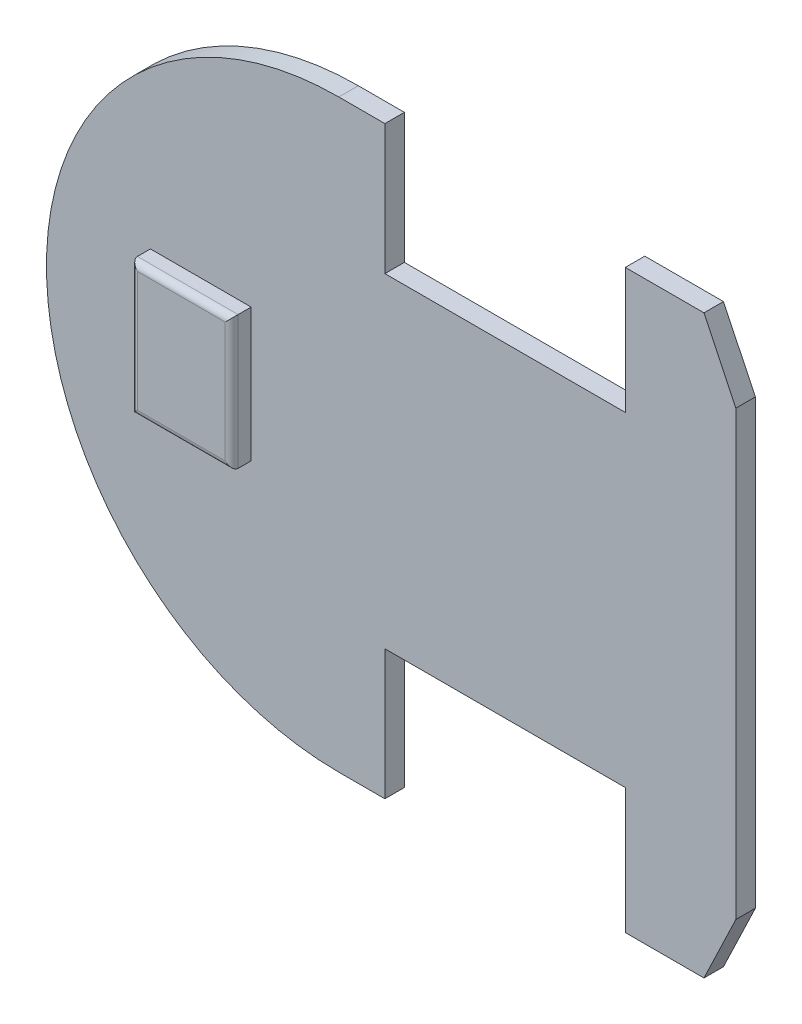
ISO-10303-21;
HEADER;
FILE_DESCRIPTION(('STEP AP214'),'2;1');
FILE_NAME('part.step','',(''),(''),'','','');
FILE_SCHEMA(('AUTOMOTIVE_DESIGN { 1 0 10303 214 1 1 1 1 }'));
ENDSEC;
DATA;
#1=APPLICATION_CONTEXT('core data for automotive mechanical design processes');
#2=APPLICATION_PROTOCOL_DEFINITION('international standard','automotive_design',2000,#1);
#3=PRODUCT_CONTEXT('',#1,'mechanical');
#4=PRODUCT('Part','Part','',(#3));
#5=PRODUCT_RELATED_PRODUCT_CATEGORY('part','',(#4));
#6=PRODUCT_DEFINITION_FORMATION('','',#4);
#7=PRODUCT_DEFINITION_CONTEXT('part definition',#1,'design');
#8=PRODUCT_DEFINITION('design','',#6,#7);
#9=PRODUCT_DEFINITION_SHAPE('','',#8);
#10=(LENGTH_UNIT() NAMED_UNIT(*) SI_UNIT(.MILLI.,.METRE.));
#11=(NAMED_UNIT(*) PLANE_ANGLE_UNIT() SI_UNIT($,.RADIAN.));
#12=(NAMED_UNIT(*) SI_UNIT($,.STERADIAN.) SOLID_ANGLE_UNIT());
#13=UNCERTAINTY_MEASURE_WITH_UNIT(LENGTH_MEASURE(1.E-05),#10,'distance_accuracy_value','');
#14=(GEOMETRIC_REPRESENTATION_CONTEXT(3) GLOBAL_UNCERTAINTY_ASSIGNED_CONTEXT((#13)) GLOBAL_UNIT_ASSIGNED_CONTEXT((#10,
#11,#12)) REPRESENTATION_CONTEXT('',''));
#15=CARTESIAN_POINT('',(0.,0.,0.));
#16=DIRECTION('',(0.,0.,1.));
#17=DIRECTION('',(1.,0.,0.));
#18=AXIS2_PLACEMENT_3D('',#15,#16,#17);
#19=CARTESIAN_POINT('',(-30.1222737594646,-1.14933559007348,3.));
#20=DIRECTION('',(0.,0.,1.));
#21=DIRECTION('',(1.,0.,0.));
#22=AXIS2_PLACEMENT_3D('',#19,#20,#21);
#23=PLANE('',#22);
#24=CARTESIAN_POINT('',(-30.1222737594646,-1.14933559007348,3.));
#25=DIRECTION('',(0.,0.,1.));
#26=DIRECTION('',(1.,0.,0.));
#27=AXIS2_PLACEMENT_3D('',#24,#25,#26);
#28=CIRCLE('',#27,45.);
#29=CARTESIAN_POINT('',(-30.1222737594646,43.8506644099265,3.));
#30=VERTEX_POINT('',#29);
#31=CARTESIAN_POINT('',(-30.1222737594646,-46.1493355900735,3.));
#32=VERTEX_POINT('',#31);
#33=EDGE_CURVE('E281',#30,#32,#28,.T.);
#34=ORIENTED_EDGE('',*,*,#33,.T.);
#35=DIRECTION('',(1.,0.,0.));
#36=VECTOR('',#35,1.);
#37=CARTESIAN_POINT('',(-30.1222737594646,-46.1493355900735,3.));
#38=LINE('',#37,#36);
#39=CARTESIAN_POINT('',(-23.0350821738382,-46.1493355900735,3.));
#40=VERTEX_POINT('',#39);
#41=EDGE_CURVE('E278',#32,#40,#38,.T.);
#42=ORIENTED_EDGE('',*,*,#41,.T.);
#43=DIRECTION('',(0.,1.,0.));
#44=VECTOR('',#43,1.);
#45=CARTESIAN_POINT('',(-23.0350821738382,-46.1493355900735,3.));
#46=LINE('',#45,#44);
#47=CARTESIAN_POINT('',(-23.0350821738382,-26.1493355900735,3.));
#48=VERTEX_POINT('',#47);
#49=EDGE_CURVE('E275',#40,#48,#46,.T.);
#50=ORIENTED_EDGE('',*,*,#49,.T.);
#51=DIRECTION('',(1.,0.,0.));
#52=VECTOR('',#51,1.);
#53=CARTESIAN_POINT('',(-23.0350821738382,-26.1493355900735,3.));
#54=LINE('',#53,#52);
#55=CARTESIAN_POINT('',(13.9649178261618,-26.1493355900735,3.));
#56=VERTEX_POINT('',#55);
#57=EDGE_CURVE('E272',#48,#56,#54,.T.);
#58=ORIENTED_EDGE('',*,*,#57,.T.);
#59=DIRECTION('',(0.,-1.,0.));
#60=VECTOR('',#59,1.);
#61=CARTESIAN_POINT('',(13.9649178261618,-45.4803298320509,3.));
#62=LINE('',#61,#60);
#63=CARTESIAN_POINT('',(13.9649178261618,-45.4803298320509,3.));
#64=VERTEX_POINT('',#63);
#65=EDGE_CURVE('E269',#56,#64,#62,.T.);
#66=ORIENTED_EDGE('',*,*,#65,.T.);
#67=DIRECTION('',(1.,0.,0.));
#68=VECTOR('',#67,1.);
#69=CARTESIAN_POINT('',(13.9649178261618,-45.4803298320509,3.));
#70=LINE('',#69,#68);
#71=CARTESIAN_POINT('',(26.0736834806823,-45.4803298320509,3.));
#72=VERTEX_POINT('',#71);
#73=EDGE_CURVE('E266',#64,#72,#70,.T.);
#74=ORIENTED_EDGE('',*,*,#73,.T.);
#75=DIRECTION('',(0.431799309874715,0.901969709021162,0.));
#76=VECTOR('',#75,1.);
#77=CARTESIAN_POINT('',(26.0736834806823,-45.4803298320509,3.));
#78=LINE('',#77,#76);
#79=CARTESIAN_POINT('',(30.9824239012434,-35.2266423722944,3.));
#80=VERTEX_POINT('',#79);
#81=EDGE_CURVE('E263',#72,#80,#78,.T.);
#82=ORIENTED_EDGE('',*,*,#81,.T.);
#83=DIRECTION('',(0.,1.,0.));
#84=VECTOR('',#83,1.);
#85=CARTESIAN_POINT('',(30.9824239012434,-35.2266423722944,3.));
#86=LINE('',#85,#84);
#87=CARTESIAN_POINT('',(30.9824239012434,32.9279711921474,3.));
#88=VERTEX_POINT('',#87);
#89=EDGE_CURVE('E260',#80,#88,#86,.T.);
#90=ORIENTED_EDGE('',*,*,#89,.T.);
#91=DIRECTION('',(-0.431799309874715,0.901969709021162,0.));
#92=VECTOR('',#91,1.);
#93=CARTESIAN_POINT('',(26.0736834806823,43.181658651904,3.));
#94=LINE('',#93,#92);
#95=CARTESIAN_POINT('',(26.0736834806823,43.181658651904,3.));
#96=VERTEX_POINT('',#95);
#97=EDGE_CURVE('E257',#88,#96,#94,.T.);
#98=ORIENTED_EDGE('',*,*,#97,.T.);
#99=DIRECTION('',(-1.,0.,0.));
#100=VECTOR('',#99,1.);
#101=CARTESIAN_POINT('',(13.9649178261618,43.181658651904,3.));
#102=LINE('',#101,#100);
#103=CARTESIAN_POINT('',(13.9649178261618,43.181658651904,3.));
#104=VERTEX_POINT('',#103);
#105=EDGE_CURVE('E254',#96,#104,#102,.T.);
#106=ORIENTED_EDGE('',*,*,#105,.T.);
#107=DIRECTION('',(0.,-1.,0.));
#108=VECTOR('',#107,1.);
#109=CARTESIAN_POINT('',(13.9649178261618,43.181658651904,3.));
#110=LINE('',#109,#108);
#111=CARTESIAN_POINT('',(13.9649178261618,23.8506644099265,3.));
#112=VERTEX_POINT('',#111);
#113=EDGE_CURVE('E251',#104,#112,#110,.T.);
#114=ORIENTED_EDGE('',*,*,#113,.T.);
#115=DIRECTION('',(-1.,0.,0.));
#116=VECTOR('',#115,1.);
#117=CARTESIAN_POINT('',(-23.0350821738382,23.8506644099265,3.));
#118=LINE('',#117,#116);
#119=CARTESIAN_POINT('',(-23.0350821738382,23.8506644099265,3.));
#120=VERTEX_POINT('',#119);
#121=EDGE_CURVE('E248',#112,#120,#118,.T.);
#122=ORIENTED_EDGE('',*,*,#121,.T.);
#123=DIRECTION('',(0.,1.,0.));
#124=VECTOR('',#123,1.);
#125=CARTESIAN_POINT('',(-23.0350821738382,43.8506644099265,3.));
#126=LINE('',#125,#124);
#127=CARTESIAN_POINT('',(-23.0350821738382,43.8506644099265,3.));
#128=VERTEX_POINT('',#127);
#129=EDGE_CURVE('E245',#120,#128,#126,.T.);
#130=ORIENTED_EDGE('',*,*,#129,.T.);
#131=DIRECTION('',(-1.,0.,0.));
#132=VECTOR('',#131,1.);
#133=CARTESIAN_POINT('',(-30.1222737594646,43.8506644099265,3.));
#134=LINE('',#133,#132);
#135=EDGE_CURVE('E224',#128,#30,#134,.T.);
#136=ORIENTED_EDGE('',*,*,#135,.T.);
#137=EDGE_LOOP('',(#34,#42,#50,#58,#66,#74,#82,#90,#98,#106,#114,#122,#130,#136));
#138=FACE_BOUND('',#137,.T.);
#139=DIRECTION('',(0.,-1.,0.));
#140=VECTOR('',#139,1.);
#141=CARTESIAN_POINT('',(-59.1222737594646,-11.3993355900735,3.));
#142=LINE('',#141,#140);
#143=CARTESIAN_POINT('',(-59.1222737594646,9.10066440992651,3.));
#144=VERTEX_POINT('',#143);
#145=CARTESIAN_POINT('',(-59.1222737594646,-11.3993355900735,3.));
#146=VERTEX_POINT('',#145);
#147=EDGE_CURVE('E59',#144,#146,#142,.T.);
#148=ORIENTED_EDGE('',*,*,#147,.F.);
#149=DIRECTION('',(-1.,0.,0.));
#150=VECTOR('',#149,1.);
#151=CARTESIAN_POINT('',(-59.1222737594646,9.10066440992651,3.));
#152=LINE('',#151,#150);
#153=CARTESIAN_POINT('',(-43.6222737594646,9.10066440992652,3.));
#154=VERTEX_POINT('',#153);
#155=EDGE_CURVE('E66',#154,#144,#152,.T.);
#156=ORIENTED_EDGE('',*,*,#155,.F.);
#157=DIRECTION('',(0.,1.,0.));
#158=VECTOR('',#157,1.);
#159=CARTESIAN_POINT('',(-43.6222737594646,-11.3993355900735,3.));
#160=LINE('',#159,#158);
#161=CARTESIAN_POINT('',(-43.6222737594646,-11.3993355900735,3.));
#162=VERTEX_POINT('',#161);
#163=EDGE_CURVE('E212',#162,#154,#160,.T.);
#164=ORIENTED_EDGE('',*,*,#163,.F.);
#165=DIRECTION('',(1.,0.,0.));
#166=VECTOR('',#165,1.);
#167=CARTESIAN_POINT('',(-59.1222737594646,-11.3993355900735,3.));
#168=LINE('',#167,#166);
#169=EDGE_CURVE('E90',#146,#162,#168,.T.);
#170=ORIENTED_EDGE('',*,*,#169,.F.);
#171=EDGE_LOOP('',(#148,#156,#164,#170));
#172=FACE_BOUND('',#171,.T.);
#173=ADVANCED_FACE('F55',(#138,#172),#23,.T.);
#174=CARTESIAN_POINT('',(-30.1222737594646,-1.14933559007348,0.));
#175=DIRECTION('',(0.,0.,1.));
#176=DIRECTION('',(1.,0.,0.));
#177=AXIS2_PLACEMENT_3D('',#174,#175,#176);
#178=PLANE('',#177);
#179=DIRECTION('',(1.,0.,0.));
#180=VECTOR('',#179,1.);
#181=CARTESIAN_POINT('',(-59.1222737594646,9.10066440992651,0.));
#182=LINE('',#181,#180);
#183=CARTESIAN_POINT('',(-59.1222737594646,9.10066440992651,0.));
#184=VERTEX_POINT('',#183);
#185=CARTESIAN_POINT('',(-43.6222737594646,9.10066440992652,0.));
#186=VERTEX_POINT('',#185);
#187=EDGE_CURVE('E197',#184,#186,#182,.T.);
#188=ORIENTED_EDGE('',*,*,#187,.F.);
#189=DIRECTION('',(0.,1.,0.));
#190=VECTOR('',#189,1.);
#191=CARTESIAN_POINT('',(-59.1222737594646,-11.3993355900735,0.));
#192=LINE('',#191,#190);
#193=CARTESIAN_POINT('',(-59.1222737594646,-11.3993355900735,0.));
#194=VERTEX_POINT('',#193);
#195=EDGE_CURVE('E189',#194,#184,#192,.T.);
#196=ORIENTED_EDGE('',*,*,#195,.F.);
#197=DIRECTION('',(1.,0.,0.));
#198=VECTOR('',#197,1.);
#199=CARTESIAN_POINT('',(-59.1222737594646,-11.3993355900735,0.));
#200=LINE('',#199,#198);
#201=CARTESIAN_POINT('',(-43.6222737594646,-11.3993355900735,0.));
#202=VERTEX_POINT('',#201);
#203=EDGE_CURVE('E220',#194,#202,#200,.T.);
#204=ORIENTED_EDGE('',*,*,#203,.T.);
#205=DIRECTION('',(0.,1.,0.));
#206=VECTOR('',#205,1.);
#207=CARTESIAN_POINT('',(-43.6222737594646,-11.3993355900735,0.));
#208=LINE('',#207,#206);
#209=EDGE_CURVE('E223',#202,#186,#208,.T.);
#210=ORIENTED_EDGE('',*,*,#209,.T.);
#211=EDGE_LOOP('',(#188,#196,#204,#210));
#212=FACE_BOUND('',#211,.T.);
#213=CARTESIAN_POINT('',(-30.1222737594646,-1.14933559007348,0.));
#214=DIRECTION('',(0.,0.,1.));
#215=DIRECTION('',(1.,0.,0.));
#216=AXIS2_PLACEMENT_3D('',#213,#214,#215);
#217=CIRCLE('',#216,45.);
#218=CARTESIAN_POINT('',(-30.1222737594646,43.8506644099265,0.));
#219=VERTEX_POINT('',#218);
#220=CARTESIAN_POINT('',(-30.1222737594646,-46.1493355900735,0.));
#221=VERTEX_POINT('',#220);
#222=EDGE_CURVE('E227',#219,#221,#217,.T.);
#223=ORIENTED_EDGE('',*,*,#222,.F.);
#224=DIRECTION('',(-1.,0.,0.));
#225=VECTOR('',#224,1.);
#226=CARTESIAN_POINT('',(-30.1222737594646,43.8506644099265,0.));
#227=LINE('',#226,#225);
#228=CARTESIAN_POINT('',(-23.0350821738382,43.8506644099265,0.));
#229=VERTEX_POINT('',#228);
#230=EDGE_CURVE('E207',#229,#219,#227,.T.);
#231=ORIENTED_EDGE('',*,*,#230,.F.);
#232=DIRECTION('',(0.,1.,0.));
#233=VECTOR('',#232,1.);
#234=CARTESIAN_POINT('',(-23.0350821738382,43.8506644099265,0.));
#235=LINE('',#234,#233);
#236=CARTESIAN_POINT('',(-23.0350821738382,23.8506644099265,0.));
#237=VERTEX_POINT('',#236);
#238=EDGE_CURVE('E348',#237,#229,#235,.T.);
#239=ORIENTED_EDGE('',*,*,#238,.F.);
#240=DIRECTION('',(-1.,0.,0.));
#241=VECTOR('',#240,1.);
#242=CARTESIAN_POINT('',(-23.0350821738382,23.8506644099265,0.));
#243=LINE('',#242,#241);
#244=CARTESIAN_POINT('',(13.9649178261618,23.8506644099265,0.));
#245=VERTEX_POINT('',#244);
#246=EDGE_CURVE('E343',#245,#237,#243,.T.);
#247=ORIENTED_EDGE('',*,*,#246,.F.);
#248=DIRECTION('',(0.,-1.,0.));
#249=VECTOR('',#248,1.);
#250=CARTESIAN_POINT('',(13.9649178261618,43.181658651904,0.));
#251=LINE('',#250,#249);
#252=CARTESIAN_POINT('',(13.9649178261618,43.181658651904,0.));
#253=VERTEX_POINT('',#252);
#254=EDGE_CURVE('E338',#253,#245,#251,.T.);
#255=ORIENTED_EDGE('',*,*,#254,.F.);
#256=DIRECTION('',(-1.,0.,0.));
#257=VECTOR('',#256,1.);
#258=CARTESIAN_POINT('',(13.9649178261618,43.181658651904,0.));
#259=LINE('',#258,#257);
#260=CARTESIAN_POINT('',(26.0736834806823,43.181658651904,0.));
#261=VERTEX_POINT('',#260);
#262=EDGE_CURVE('E333',#261,#253,#259,.T.);
#263=ORIENTED_EDGE('',*,*,#262,.F.);
#264=DIRECTION('',(-0.431799309874715,0.901969709021162,0.));
#265=VECTOR('',#264,1.);
#266=CARTESIAN_POINT('',(26.0736834806823,43.181658651904,0.));
#267=LINE('',#266,#265);
#268=CARTESIAN_POINT('',(30.9824239012434,32.9279711921474,0.));
#269=VERTEX_POINT('',#268);
#270=EDGE_CURVE('E328',#269,#261,#267,.T.);
#271=ORIENTED_EDGE('',*,*,#270,.F.);
#272=DIRECTION('',(0.,1.,0.));
#273=VECTOR('',#272,1.);
#274=CARTESIAN_POINT('',(30.9824239012434,-35.2266423722944,0.));
#275=LINE('',#274,#273);
#276=CARTESIAN_POINT('',(30.9824239012434,-35.2266423722944,0.));
#277=VERTEX_POINT('',#276);
#278=EDGE_CURVE('E323',#277,#269,#275,.T.);
#279=ORIENTED_EDGE('',*,*,#278,.F.);
#280=DIRECTION('',(0.431799309874715,0.901969709021162,0.));
#281=VECTOR('',#280,1.);
#282=CARTESIAN_POINT('',(26.0736834806823,-45.4803298320509,0.));
#283=LINE('',#282,#281);
#284=CARTESIAN_POINT('',(26.0736834806823,-45.4803298320509,0.));
#285=VERTEX_POINT('',#284);
#286=EDGE_CURVE('E318',#285,#277,#283,.T.);
#287=ORIENTED_EDGE('',*,*,#286,.F.);
#288=DIRECTION('',(1.,0.,0.));
#289=VECTOR('',#288,1.);
#290=CARTESIAN_POINT('',(13.9649178261618,-45.4803298320509,0.));
#291=LINE('',#290,#289);
#292=CARTESIAN_POINT('',(13.9649178261618,-45.4803298320509,0.));
#293=VERTEX_POINT('',#292);
#294=EDGE_CURVE('E313',#293,#285,#291,.T.);
#295=ORIENTED_EDGE('',*,*,#294,.F.);
#296=DIRECTION('',(0.,-1.,0.));
#297=VECTOR('',#296,1.);
#298=CARTESIAN_POINT('',(13.9649178261618,-45.4803298320509,0.));
#299=LINE('',#298,#297);
#300=CARTESIAN_POINT('',(13.9649178261618,-26.1493355900735,0.));
#301=VERTEX_POINT('',#300);
#302=EDGE_CURVE('E308',#301,#293,#299,.T.);
#303=ORIENTED_EDGE('',*,*,#302,.F.);
#304=DIRECTION('',(1.,0.,0.));
#305=VECTOR('',#304,1.);
#306=CARTESIAN_POINT('',(-23.0350821738382,-26.1493355900735,0.));
#307=LINE('',#306,#305);
#308=CARTESIAN_POINT('',(-23.0350821738382,-26.1493355900735,0.));
#309=VERTEX_POINT('',#308);
#310=EDGE_CURVE('E303',#309,#301,#307,.T.);
#311=ORIENTED_EDGE('',*,*,#310,.F.);
#312=DIRECTION('',(0.,1.,0.));
#313=VECTOR('',#312,1.);
#314=CARTESIAN_POINT('',(-23.0350821738382,-46.1493355900735,0.));
#315=LINE('',#314,#313);
#316=CARTESIAN_POINT('',(-23.0350821738382,-46.1493355900735,0.));
#317=VERTEX_POINT('',#316);
#318=EDGE_CURVE('E294',#317,#309,#315,.T.);
#319=ORIENTED_EDGE('',*,*,#318,.F.);
#320=DIRECTION('',(1.,0.,0.));
#321=VECTOR('',#320,1.);
#322=CARTESIAN_POINT('',(-30.1222737594646,-46.1493355900735,0.));
#323=LINE('',#322,#321);
#324=EDGE_CURVE('E238',#221,#317,#323,.T.);
#325=ORIENTED_EDGE('',*,*,#324,.F.);
#326=EDGE_LOOP('',(#223,#231,#239,#247,#255,#263,#271,#279,#287,#295,#303,#311,#319,#325));
#327=FACE_BOUND('',#326,.T.);
#328=ADVANCED_FACE('F388',(#212,#327),#178,.F.);
#329=CARTESIAN_POINT('',(-30.1222737594646,-1.14933559007348,3.));
#330=DIRECTION('',(0.,0.,-1.));
#331=DIRECTION('',(-1.,0.,0.));
#332=AXIS2_PLACEMENT_3D('',#329,#330,#331);
#333=CYLINDRICAL_SURFACE('',#332,45.);
#334=ORIENTED_EDGE('',*,*,#222,.T.);
#335=DIRECTION('',(0.,0.,-1.));
#336=VECTOR('',#335,1.);
#337=CARTESIAN_POINT('',(-30.1222737594646,-46.1493355900735,3.));
#338=LINE('',#337,#336);
#339=EDGE_CURVE('E290',#32,#221,#338,.T.);
#340=ORIENTED_EDGE('',*,*,#339,.F.);
#341=ORIENTED_EDGE('',*,*,#33,.F.);
#342=DIRECTION('',(0.,0.,-1.));
#343=VECTOR('',#342,1.);
#344=CARTESIAN_POINT('',(-30.1222737594646,43.8506644099265,3.));
#345=LINE('',#344,#343);
#346=EDGE_CURVE('E231',#30,#219,#345,.T.);
#347=ORIENTED_EDGE('',*,*,#346,.T.);
#348=EDGE_LOOP('',(#334,#340,#341,#347));
#349=FACE_BOUND('',#348,.T.);
#350=ADVANCED_FACE('F291',(#349),#333,.T.);
#351=CARTESIAN_POINT('',(-30.1222737594646,-46.1493355900735,3.));
#352=DIRECTION('',(0.,1.,0.));
#353=DIRECTION('',(0.,0.,1.));
#354=AXIS2_PLACEMENT_3D('',#351,#352,#353);
#355=PLANE('',#354);
#356=ORIENTED_EDGE('',*,*,#324,.T.);
#357=DIRECTION('',(0.,0.,-1.));
#358=VECTOR('',#357,1.);
#359=CARTESIAN_POINT('',(-23.0350821738382,-46.1493355900735,3.));
#360=LINE('',#359,#358);
#361=EDGE_CURVE('E298',#40,#317,#360,.T.);
#362=ORIENTED_EDGE('',*,*,#361,.F.);
#363=ORIENTED_EDGE('',*,*,#41,.F.);
#364=ORIENTED_EDGE('',*,*,#339,.T.);
#365=EDGE_LOOP('',(#356,#362,#363,#364));
#366=FACE_BOUND('',#365,.T.);
#367=ADVANCED_FACE('F405',(#366),#355,.F.);
#368=CARTESIAN_POINT('',(-23.0350821738382,-46.1493355900735,3.));
#369=DIRECTION('',(-1.,0.,0.));
#370=DIRECTION('',(0.,0.,1.));
#371=AXIS2_PLACEMENT_3D('',#368,#369,#370);
#372=PLANE('',#371);
#373=ORIENTED_EDGE('',*,*,#318,.T.);
#374=DIRECTION('',(0.,0.,-1.));
#375=VECTOR('',#374,1.);
#376=CARTESIAN_POINT('',(-23.0350821738382,-26.1493355900735,3.));
#377=LINE('',#376,#375);
#378=EDGE_CURVE('E304',#48,#309,#377,.T.);
#379=ORIENTED_EDGE('',*,*,#378,.F.);
#380=ORIENTED_EDGE('',*,*,#49,.F.);
#381=ORIENTED_EDGE('',*,*,#361,.T.);
#382=EDGE_LOOP('',(#373,#379,#380,#381));
#383=FACE_BOUND('',#382,.T.);
#384=ADVANCED_FACE('F403',(#383),#372,.F.);
#385=CARTESIAN_POINT('',(-23.0350821738382,-26.1493355900735,3.));
#386=DIRECTION('',(0.,1.,0.));
#387=DIRECTION('',(-1.,0.,0.));
#388=AXIS2_PLACEMENT_3D('',#385,#386,#387);
#389=PLANE('',#388);
#390=ORIENTED_EDGE('',*,*,#310,.T.);
#391=DIRECTION('',(0.,0.,-1.));
#392=VECTOR('',#391,1.);
#393=CARTESIAN_POINT('',(13.9649178261618,-26.1493355900735,3.));
#394=LINE('',#393,#392);
#395=EDGE_CURVE('E309',#56,#301,#394,.T.);
#396=ORIENTED_EDGE('',*,*,#395,.F.);
#397=ORIENTED_EDGE('',*,*,#57,.F.);
#398=ORIENTED_EDGE('',*,*,#378,.T.);
#399=EDGE_LOOP('',(#390,#396,#397,#398));
#400=FACE_BOUND('',#399,.T.);
#401=ADVANCED_FACE('F377',(#400),#389,.F.);
#402=CARTESIAN_POINT('',(13.9649178261618,-45.4803298320509,3.));
#403=DIRECTION('',(1.,0.,0.));
#404=DIRECTION('',(0.,0.,-1.));
#405=AXIS2_PLACEMENT_3D('',#402,#403,#404);
#406=PLANE('',#405);
#407=ORIENTED_EDGE('',*,*,#302,.T.);
#408=DIRECTION('',(0.,0.,-1.));
#409=VECTOR('',#408,1.);
#410=CARTESIAN_POINT('',(13.9649178261618,-45.4803298320509,3.));
#411=LINE('',#410,#409);
#412=EDGE_CURVE('E314',#64,#293,#411,.T.);
#413=ORIENTED_EDGE('',*,*,#412,.F.);
#414=ORIENTED_EDGE('',*,*,#65,.F.);
#415=ORIENTED_EDGE('',*,*,#395,.T.);
#416=EDGE_LOOP('',(#407,#413,#414,#415));
#417=FACE_BOUND('',#416,.T.);
#418=ADVANCED_FACE('F385',(#417),#406,.F.);
#419=CARTESIAN_POINT('',(13.9649178261618,-45.4803298320509,3.));
#420=DIRECTION('',(0.,1.,0.));
#421=DIRECTION('',(0.,0.,1.));
#422=AXIS2_PLACEMENT_3D('',#419,#420,#421);
#423=PLANE('',#422);
#424=ORIENTED_EDGE('',*,*,#294,.T.);
#425=DIRECTION('',(0.,0.,-1.));
#426=VECTOR('',#425,1.);
#427=CARTESIAN_POINT('',(26.0736834806823,-45.4803298320509,3.));
#428=LINE('',#427,#426);
#429=EDGE_CURVE('E319',#72,#285,#428,.T.);
#430=ORIENTED_EDGE('',*,*,#429,.F.);
#431=ORIENTED_EDGE('',*,*,#73,.F.);
#432=ORIENTED_EDGE('',*,*,#412,.T.);
#433=EDGE_LOOP('',(#424,#430,#431,#432));
#434=FACE_BOUND('',#433,.T.);
#435=ADVANCED_FACE('F393',(#434),#423,.F.);
#436=CARTESIAN_POINT('',(26.0736834806823,-45.4803298320509,3.));
#437=DIRECTION('',(-0.901969709021162,0.431799309874715,0.));
#438=DIRECTION('',(-0.431799309874715,-0.901969709021162,0.));
#439=AXIS2_PLACEMENT_3D('',#436,#437,#438);
#440=PLANE('',#439);
#441=ORIENTED_EDGE('',*,*,#286,.T.);
#442=DIRECTION('',(0.,0.,-1.));
#443=VECTOR('',#442,1.);
#444=CARTESIAN_POINT('',(30.9824239012434,-35.2266423722944,3.));
#445=LINE('',#444,#443);
#446=EDGE_CURVE('E324',#80,#277,#445,.T.);
#447=ORIENTED_EDGE('',*,*,#446,.F.);
#448=ORIENTED_EDGE('',*,*,#81,.F.);
#449=ORIENTED_EDGE('',*,*,#429,.T.);
#450=EDGE_LOOP('',(#441,#447,#448,#449));
#451=FACE_BOUND('',#450,.T.);
#452=ADVANCED_FACE('F397',(#451),#440,.F.);
#453=CARTESIAN_POINT('',(30.9824239012434,-35.2266423722944,3.));
#454=DIRECTION('',(-1.,0.,0.));
#455=DIRECTION('',(0.,0.,1.));
#456=AXIS2_PLACEMENT_3D('',#453,#454,#455);
#457=PLANE('',#456);
#458=ORIENTED_EDGE('',*,*,#278,.T.);
#459=DIRECTION('',(0.,0.,-1.));
#460=VECTOR('',#459,1.);
#461=CARTESIAN_POINT('',(30.9824239012434,32.9279711921474,3.));
#462=LINE('',#461,#460);
#463=EDGE_CURVE('E329',#88,#269,#462,.T.);
#464=ORIENTED_EDGE('',*,*,#463,.F.);
#465=ORIENTED_EDGE('',*,*,#89,.F.);
#466=ORIENTED_EDGE('',*,*,#446,.T.);
#467=EDGE_LOOP('',(#458,#464,#465,#466));
#468=FACE_BOUND('',#467,.T.);
#469=ADVANCED_FACE('F491',(#468),#457,.F.);
#470=CARTESIAN_POINT('',(26.0736834806823,43.181658651904,3.));
#471=DIRECTION('',(-0.901969709021162,-0.431799309874715,0.));
#472=DIRECTION('',(0.431799309874715,-0.901969709021162,0.));
#473=AXIS2_PLACEMENT_3D('',#470,#471,#472);
#474=PLANE('',#473);
#475=ORIENTED_EDGE('',*,*,#270,.T.);
#476=DIRECTION('',(0.,0.,-1.));
#477=VECTOR('',#476,1.);
#478=CARTESIAN_POINT('',(26.0736834806823,43.181658651904,3.));
#479=LINE('',#478,#477);
#480=EDGE_CURVE('E334',#96,#261,#479,.T.);
#481=ORIENTED_EDGE('',*,*,#480,.F.);
#482=ORIENTED_EDGE('',*,*,#97,.F.);
#483=ORIENTED_EDGE('',*,*,#463,.T.);
#484=EDGE_LOOP('',(#475,#481,#482,#483));
#485=FACE_BOUND('',#484,.T.);
#486=ADVANCED_FACE('F482',(#485),#474,.F.);
#487=CARTESIAN_POINT('',(13.9649178261618,43.181658651904,3.));
#488=DIRECTION('',(0.,-1.,0.));
#489=DIRECTION('',(0.,0.,-1.));
#490=AXIS2_PLACEMENT_3D('',#487,#488,#489);
#491=PLANE('',#490);
#492=ORIENTED_EDGE('',*,*,#262,.T.);
#493=DIRECTION('',(0.,0.,-1.));
#494=VECTOR('',#493,1.);
#495=CARTESIAN_POINT('',(13.9649178261618,43.181658651904,3.));
#496=LINE('',#495,#494);
#497=EDGE_CURVE('E339',#104,#253,#496,.T.);
#498=ORIENTED_EDGE('',*,*,#497,.F.);
#499=ORIENTED_EDGE('',*,*,#105,.F.);
#500=ORIENTED_EDGE('',*,*,#480,.T.);
#501=EDGE_LOOP('',(#492,#498,#499,#500));
#502=FACE_BOUND('',#501,.T.);
#503=ADVANCED_FACE('F473',(#502),#491,.F.);
#504=CARTESIAN_POINT('',(13.9649178261618,43.181658651904,3.));
#505=DIRECTION('',(1.,0.,0.));
#506=DIRECTION('',(0.,0.,-1.));
#507=AXIS2_PLACEMENT_3D('',#504,#505,#506);
#508=PLANE('',#507);
#509=ORIENTED_EDGE('',*,*,#254,.T.);
#510=DIRECTION('',(0.,0.,-1.));
#511=VECTOR('',#510,1.);
#512=CARTESIAN_POINT('',(13.9649178261618,23.8506644099265,3.));
#513=LINE('',#512,#511);
#514=EDGE_CURVE('E344',#112,#245,#513,.T.);
#515=ORIENTED_EDGE('',*,*,#514,.F.);
#516=ORIENTED_EDGE('',*,*,#113,.F.);
#517=ORIENTED_EDGE('',*,*,#497,.T.);
#518=EDGE_LOOP('',(#509,#515,#516,#517));
#519=FACE_BOUND('',#518,.T.);
#520=ADVANCED_FACE('F464',(#519),#508,.F.);
#521=CARTESIAN_POINT('',(-23.0350821738382,23.8506644099265,3.));
#522=DIRECTION('',(0.,-1.,0.));
#523=DIRECTION('',(1.,0.,0.));
#524=AXIS2_PLACEMENT_3D('',#521,#522,#523);
#525=PLANE('',#524);
#526=ORIENTED_EDGE('',*,*,#246,.T.);
#527=DIRECTION('',(0.,0.,-1.));
#528=VECTOR('',#527,1.);
#529=CARTESIAN_POINT('',(-23.0350821738382,23.8506644099265,3.));
#530=LINE('',#529,#528);
#531=EDGE_CURVE('E349',#120,#237,#530,.T.);
#532=ORIENTED_EDGE('',*,*,#531,.F.);
#533=ORIENTED_EDGE('',*,*,#121,.F.);
#534=ORIENTED_EDGE('',*,*,#514,.T.);
#535=EDGE_LOOP('',(#526,#532,#533,#534));
#536=FACE_BOUND('',#535,.T.);
#537=ADVANCED_FACE('F455',(#536),#525,.F.);
#538=CARTESIAN_POINT('',(-23.0350821738382,43.8506644099265,3.));
#539=DIRECTION('',(-1.,0.,0.));
#540=DIRECTION('',(0.,0.,1.));
#541=AXIS2_PLACEMENT_3D('',#538,#539,#540);
#542=PLANE('',#541);
#543=ORIENTED_EDGE('',*,*,#238,.T.);
#544=DIRECTION('',(0.,0.,-1.));
#545=VECTOR('',#544,1.);
#546=CARTESIAN_POINT('',(-23.0350821738382,43.8506644099265,3.));
#547=LINE('',#546,#545);
#548=EDGE_CURVE('E203',#128,#229,#547,.T.);
#549=ORIENTED_EDGE('',*,*,#548,.F.);
#550=ORIENTED_EDGE('',*,*,#129,.F.);
#551=ORIENTED_EDGE('',*,*,#531,.T.);
#552=EDGE_LOOP('',(#543,#549,#550,#551));
#553=FACE_BOUND('',#552,.T.);
#554=ADVANCED_FACE('F447',(#553),#542,.F.);
#555=CARTESIAN_POINT('',(-30.1222737594646,43.8506644099265,3.));
#556=DIRECTION('',(0.,-1.,0.));
#557=DIRECTION('',(0.,0.,-1.));
#558=AXIS2_PLACEMENT_3D('',#555,#556,#557);
#559=PLANE('',#558);
#560=ORIENTED_EDGE('',*,*,#230,.T.);
#561=ORIENTED_EDGE('',*,*,#346,.F.);
#562=ORIENTED_EDGE('',*,*,#135,.F.);
#563=ORIENTED_EDGE('',*,*,#548,.T.);
#564=EDGE_LOOP('',(#560,#561,#562,#563));
#565=FACE_BOUND('',#564,.T.);
#566=ADVANCED_FACE('F424',(#565),#559,.F.);
#567=CARTESIAN_POINT('',(-59.1222737594646,-11.3993355900735,3.));
#568=DIRECTION('',(-1.,0.,0.));
#569=DIRECTION('',(0.,0.,1.));
#570=AXIS2_PLACEMENT_3D('',#567,#568,#569);
#571=PLANE('',#570);
#572=ORIENTED_EDGE('',*,*,#195,.T.);
#573=DIRECTION('',(0.,0.,-1.));
#574=VECTOR('',#573,1.);
#575=CARTESIAN_POINT('',(-59.1222737594646,9.10066440992651,3.));
#576=LINE('',#575,#574);
#577=EDGE_CURVE('E12',#144,#184,#576,.T.);
#578=ORIENTED_EDGE('',*,*,#577,.F.);
#579=ORIENTED_EDGE('',*,*,#147,.T.);
#580=DIRECTION('',(0.,0.,-1.));
#581=VECTOR('',#580,1.);
#582=CARTESIAN_POINT('',(-59.1222737594646,-11.3993355900735,3.));
#583=LINE('',#582,#581);
#584=EDGE_CURVE('E95',#146,#194,#583,.T.);
#585=ORIENTED_EDGE('',*,*,#584,.T.);
#586=EDGE_LOOP('',(#572,#578,#579,#585));
#587=FACE_BOUND('',#586,.T.);
#588=ADVANCED_FACE('F186',(#587),#571,.F.);
#589=CARTESIAN_POINT('',(-59.1222737594646,-11.3993355900735,3.));
#590=DIRECTION('',(0.,1.,0.));
#591=DIRECTION('',(-1.,0.,0.));
#592=AXIS2_PLACEMENT_3D('',#589,#590,#591);
#593=PLANE('',#592);
#594=ORIENTED_EDGE('',*,*,#203,.F.);
#595=ORIENTED_EDGE('',*,*,#584,.F.);
#596=ORIENTED_EDGE('',*,*,#169,.T.);
#597=DIRECTION('',(0.,0.,-1.));
#598=VECTOR('',#597,1.);
#599=CARTESIAN_POINT('',(-43.6222737594646,-11.3993355900735,3.));
#600=LINE('',#599,#598);
#601=EDGE_CURVE('E214',#162,#202,#600,.T.);
#602=ORIENTED_EDGE('',*,*,#601,.T.);
#603=EDGE_LOOP('',(#594,#595,#596,#602));
#604=FACE_BOUND('',#603,.T.);
#605=ADVANCED_FACE('F57',(#604),#593,.T.);
#606=CARTESIAN_POINT('',(-43.6222737594646,-11.3993355900735,3.));
#607=DIRECTION('',(-1.,0.,0.));
#608=DIRECTION('',(0.,-1.,0.));
#609=AXIS2_PLACEMENT_3D('',#606,#607,#608);
#610=PLANE('',#609);
#611=ORIENTED_EDGE('',*,*,#209,.F.);
#612=ORIENTED_EDGE('',*,*,#601,.F.);
#613=ORIENTED_EDGE('',*,*,#163,.T.);
#614=DIRECTION('',(0.,0.,-1.));
#615=VECTOR('',#614,1.);
#616=CARTESIAN_POINT('',(-43.6222737594646,9.10066440992652,3.));
#617=LINE('',#616,#615);
#618=EDGE_CURVE('E74',#154,#186,#617,.T.);
#619=ORIENTED_EDGE('',*,*,#618,.T.);
#620=EDGE_LOOP('',(#611,#612,#613,#619));
#621=FACE_BOUND('',#620,.T.);
#622=ADVANCED_FACE('F426',(#621),#610,.T.);
#623=CARTESIAN_POINT('',(-59.1222737594646,9.10066440992651,3.));
#624=DIRECTION('',(0.,1.,0.));
#625=DIRECTION('',(-1.,0.,0.));
#626=AXIS2_PLACEMENT_3D('',#623,#624,#625);
#627=PLANE('',#626);
#628=ORIENTED_EDGE('',*,*,#187,.T.);
#629=ORIENTED_EDGE('',*,*,#618,.F.);
#630=ORIENTED_EDGE('',*,*,#155,.T.);
#631=ORIENTED_EDGE('',*,*,#577,.T.);
#632=EDGE_LOOP('',(#628,#629,#630,#631));
#633=FACE_BOUND('',#632,.T.);
#634=ADVANCED_FACE('F193',(#633),#627,.F.);
#635=CLOSED_SHELL('',(#173,#328,#350,#367,#384,#401,#418,#435,#452,#469,#486,#503,#520,#537,
#554,#566,#588,#605,#622,#634));
#636=MANIFOLD_SOLID_BREP('B2',#635);
#637=CARTESIAN_POINT('',(0.,0.,6.));
#638=DIRECTION('',(0.,0.,1.));
#639=DIRECTION('',(1.,0.,0.));
#640=AXIS2_PLACEMENT_3D('',#637,#638,#639);
#641=PLANE('',#640);
#642=DIRECTION('',(1.,0.,0.));
#643=VECTOR('',#642,1.);
#644=CARTESIAN_POINT('',(0.,8.10066440992653,6.));
#645=LINE('',#644,#643);
#646=CARTESIAN_POINT('',(-44.6222737594646,8.10066440992652,6.));
#647=VERTEX_POINT('',#646);
#648=CARTESIAN_POINT('',(-58.1222737594646,8.10066440992651,6.));
#649=VERTEX_POINT('',#648);
#650=EDGE_CURVE('E691',#647,#649,#645,.F.);
#651=ORIENTED_EDGE('',*,*,#650,.T.);
#652=DIRECTION('',(0.,1.,0.));
#653=VECTOR('',#652,1.);
#654=CARTESIAN_POINT('',(-58.1222737594646,0.,6.));
#655=LINE('',#654,#653);
#656=CARTESIAN_POINT('',(-58.1222737594646,-10.3993355900735,6.));
#657=VERTEX_POINT('',#656);
#658=EDGE_CURVE('E693',#649,#657,#655,.F.);
#659=ORIENTED_EDGE('',*,*,#658,.T.);
#660=DIRECTION('',(1.,0.,0.));
#661=VECTOR('',#660,1.);
#662=CARTESIAN_POINT('',(-43.6222737594646,-10.3993355900735,6.));
#663=LINE('',#662,#661);
#664=CARTESIAN_POINT('',(-44.6222737594646,-10.3993355900735,6.));
#665=VERTEX_POINT('',#664);
#666=EDGE_CURVE('E681',#657,#665,#663,.T.);
#667=ORIENTED_EDGE('',*,*,#666,.T.);
#668=DIRECTION('',(0.,1.,0.));
#669=VECTOR('',#668,1.);
#670=CARTESIAN_POINT('',(-44.6222737594646,9.10066440992652,6.));
#671=LINE('',#670,#669);
#672=EDGE_CURVE('E689',#665,#647,#671,.T.);
#673=ORIENTED_EDGE('',*,*,#672,.T.);
#674=EDGE_LOOP('',(#651,#659,#667,#673));
#675=FACE_BOUND('',#674,.T.);
#676=ADVANCED_FACE('F602',(#675),#641,.T.);
#677=CARTESIAN_POINT('',(-59.1222737594646,-11.3993355900735,6.));
#678=DIRECTION('',(-1.,0.,0.));
#679=DIRECTION('',(0.,0.,1.));
#680=AXIS2_PLACEMENT_3D('',#677,#678,#679);
#681=PLANE('',#680);
#682=DIRECTION('',(0.,0.,-1.));
#683=VECTOR('',#682,1.);
#684=CARTESIAN_POINT('',(-59.1222737594646,-11.3993355900735,6.));
#685=LINE('',#684,#683);
#686=CARTESIAN_POINT('',(-59.1222737594646,-11.3993355900735,5.));
#687=VERTEX_POINT('',#686);
#688=CARTESIAN_POINT('',(-59.1222737594646,-11.3993355900735,3.));
#689=VERTEX_POINT('',#688);
#690=EDGE_CURVE('E665',#687,#689,#685,.T.);
#691=ORIENTED_EDGE('',*,*,#690,.F.);
#692=DIRECTION('',(0.,1.,0.));
#693=VECTOR('',#692,1.);
#694=CARTESIAN_POINT('',(-59.1222737594646,-11.3993355900735,5.));
#695=LINE('',#694,#693);
#696=CARTESIAN_POINT('',(-59.1222737594646,9.10066440992651,5.));
#697=VERTEX_POINT('',#696);
#698=EDGE_CURVE('E662',#687,#697,#695,.T.);
#699=ORIENTED_EDGE('',*,*,#698,.T.);
#700=DIRECTION('',(0.,0.,-1.));
#701=VECTOR('',#700,1.);
#702=CARTESIAN_POINT('',(-59.1222737594646,9.10066440992651,6.));
#703=LINE('',#702,#701);
#704=CARTESIAN_POINT('',(-59.1222737594646,9.10066440992651,3.));
#705=VERTEX_POINT('',#704);
#706=EDGE_CURVE('E656',#697,#705,#703,.T.);
#707=ORIENTED_EDGE('',*,*,#706,.T.);
#708=DIRECTION('',(0.,-1.,0.));
#709=VECTOR('',#708,1.);
#710=CARTESIAN_POINT('',(-59.1222737594646,-11.3993355900735,3.));
#711=LINE('',#710,#709);
#712=EDGE_CURVE('E660',#705,#689,#711,.T.);
#713=ORIENTED_EDGE('',*,*,#712,.T.);
#714=EDGE_LOOP('',(#691,#699,#707,#713));
#715=FACE_BOUND('',#714,.T.);
#716=ADVANCED_FACE('F659',(#715),#681,.T.);
#717=CARTESIAN_POINT('',(-59.1222737594646,9.10066440992651,6.));
#718=DIRECTION('',(0.,1.,0.));
#719=DIRECTION('',(-1.,0.,0.));
#720=AXIS2_PLACEMENT_3D('',#717,#718,#719);
#721=PLANE('',#720);
#722=ORIENTED_EDGE('',*,*,#706,.F.);
#723=DIRECTION('',(1.,0.,0.));
#724=VECTOR('',#723,1.);
#725=CARTESIAN_POINT('',(-59.1222737594646,9.10066440992651,5.));
#726=LINE('',#725,#724);
#727=CARTESIAN_POINT('',(-43.6222737594646,9.10066440992652,5.));
#728=VERTEX_POINT('',#727);
#729=EDGE_CURVE('E626',#697,#728,#726,.T.);
#730=ORIENTED_EDGE('',*,*,#729,.T.);
#731=DIRECTION('',(0.,0.,-1.));
#732=VECTOR('',#731,1.);
#733=CARTESIAN_POINT('',(-43.6222737594646,9.10066440992652,6.));
#734=LINE('',#733,#732);
#735=CARTESIAN_POINT('',(-43.6222737594646,9.10066440992652,3.));
#736=VERTEX_POINT('',#735);
#737=EDGE_CURVE('E664',#728,#736,#734,.T.);
#738=ORIENTED_EDGE('',*,*,#737,.T.);
#739=DIRECTION('',(-1.,0.,0.));
#740=VECTOR('',#739,1.);
#741=CARTESIAN_POINT('',(-59.1222737594646,9.10066440992651,3.));
#742=LINE('',#741,#740);
#743=EDGE_CURVE('E672',#736,#705,#742,.T.);
#744=ORIENTED_EDGE('',*,*,#743,.T.);
#745=EDGE_LOOP('',(#722,#730,#738,#744));
#746=FACE_BOUND('',#745,.T.);
#747=ADVANCED_FACE('F678',(#746),#721,.T.);
#748=CARTESIAN_POINT('',(-43.6222737594646,-11.3993355900735,6.));
#749=DIRECTION('',(-1.,0.,0.));
#750=DIRECTION('',(0.,-1.,0.));
#751=AXIS2_PLACEMENT_3D('',#748,#749,#750);
#752=PLANE('',#751);
#753=ORIENTED_EDGE('',*,*,#737,.F.);
#754=DIRECTION('',(0.,1.,0.));
#755=VECTOR('',#754,1.);
#756=CARTESIAN_POINT('',(-43.6222737594646,-11.3993355900735,5.));
#757=LINE('',#756,#755);
#758=CARTESIAN_POINT('',(-43.6222737594646,-11.3993355900735,5.));
#759=VERTEX_POINT('',#758);
#760=EDGE_CURVE('E611',#728,#759,#757,.F.);
#761=ORIENTED_EDGE('',*,*,#760,.T.);
#762=DIRECTION('',(0.,0.,-1.));
#763=VECTOR('',#762,1.);
#764=CARTESIAN_POINT('',(-43.6222737594646,-11.3993355900735,6.));
#765=LINE('',#764,#763);
#766=CARTESIAN_POINT('',(-43.6222737594646,-11.3993355900735,3.));
#767=VERTEX_POINT('',#766);
#768=EDGE_CURVE('E676',#759,#767,#765,.T.);
#769=ORIENTED_EDGE('',*,*,#768,.T.);
#770=DIRECTION('',(0.,1.,0.));
#771=VECTOR('',#770,1.);
#772=CARTESIAN_POINT('',(-43.6222737594646,-11.3993355900735,3.));
#773=LINE('',#772,#771);
#774=EDGE_CURVE('E679',#767,#736,#773,.T.);
#775=ORIENTED_EDGE('',*,*,#774,.T.);
#776=EDGE_LOOP('',(#753,#761,#769,#775));
#777=FACE_BOUND('',#776,.T.);
#778=ADVANCED_FACE('F713',(#777),#752,.F.);
#779=CARTESIAN_POINT('',(-59.1222737594646,-11.3993355900735,6.));
#780=DIRECTION('',(0.,1.,0.));
#781=DIRECTION('',(-1.,0.,0.));
#782=AXIS2_PLACEMENT_3D('',#779,#780,#781);
#783=PLANE('',#782);
#784=ORIENTED_EDGE('',*,*,#768,.F.);
#785=DIRECTION('',(1.,0.,0.));
#786=VECTOR('',#785,1.);
#787=CARTESIAN_POINT('',(-59.1222737594646,-11.3993355900735,5.));
#788=LINE('',#787,#786);
#789=EDGE_CURVE('E53',#759,#687,#788,.F.);
#790=ORIENTED_EDGE('',*,*,#789,.T.);
#791=ORIENTED_EDGE('',*,*,#690,.T.);
#792=DIRECTION('',(1.,0.,0.));
#793=VECTOR('',#792,1.);
#794=CARTESIAN_POINT('',(-59.1222737594646,-11.3993355900735,3.));
#795=LINE('',#794,#793);
#796=EDGE_CURVE('E675',#689,#767,#795,.T.);
#797=ORIENTED_EDGE('',*,*,#796,.T.);
#798=EDGE_LOOP('',(#784,#790,#791,#797));
#799=FACE_BOUND('',#798,.T.);
#800=ADVANCED_FACE('F714',(#799),#783,.F.);
#801=CARTESIAN_POINT('',(0.,0.,3.));
#802=DIRECTION('',(0.,0.,-1.));
#803=DIRECTION('',(-1.,0.,0.));
#804=AXIS2_PLACEMENT_3D('',#801,#802,#803);
#805=PLANE('',#804);
#806=ORIENTED_EDGE('',*,*,#712,.F.);
#807=ORIENTED_EDGE('',*,*,#743,.F.);
#808=ORIENTED_EDGE('',*,*,#774,.F.);
#809=ORIENTED_EDGE('',*,*,#796,.F.);
#810=EDGE_LOOP('',(#806,#807,#808,#809));
#811=FACE_BOUND('',#810,.T.);
#812=ADVANCED_FACE('F670',(#811),#805,.T.);
#813=CARTESIAN_POINT('',(-44.6222737594646,0.,5.));
#814=DIRECTION('',(0.,-1.,0.));
#815=DIRECTION('',(1.,0.,0.));
#816=AXIS2_PLACEMENT_3D('',#813,#814,#815);
#817=CYLINDRICAL_SURFACE('',#816,1.);
#818=CARTESIAN_POINT('',(-44.6222737594646,8.10066440992652,5.));
#819=DIRECTION('',(0.707106781186548,-0.707106781186547,0.));
#820=DIRECTION('',(-0.707106781186547,-0.707106781186548,0.));
#821=AXIS2_PLACEMENT_3D('',#818,#819,#820);
#822=ELLIPSE('',#821,1.41421356237309,1.);
#823=EDGE_CURVE('E701',#647,#728,#822,.F.);
#824=ORIENTED_EDGE('',*,*,#823,.F.);
#825=ORIENTED_EDGE('',*,*,#672,.F.);
#826=CARTESIAN_POINT('',(-44.6222737594646,-10.3993355900735,5.));
#827=DIRECTION('',(-0.707106781186547,-0.707106781186548,0.));
#828=DIRECTION('',(-0.707106781186548,0.707106781186547,0.));
#829=AXIS2_PLACEMENT_3D('',#826,#827,#828);
#830=ELLIPSE('',#829,1.4142135623731,1.);
#831=EDGE_CURVE('E606',#759,#665,#830,.T.);
#832=ORIENTED_EDGE('',*,*,#831,.F.);
#833=ORIENTED_EDGE('',*,*,#760,.F.);
#834=EDGE_LOOP('',(#824,#825,#832,#833));
#835=FACE_BOUND('',#834,.T.);
#836=ADVANCED_FACE('F604',(#835),#817,.T.);
#837=CARTESIAN_POINT('',(0.,-10.3993355900735,5.));
#838=DIRECTION('',(-1.,0.,0.));
#839=DIRECTION('',(0.,-1.,0.));
#840=AXIS2_PLACEMENT_3D('',#837,#838,#839);
#841=CYLINDRICAL_SURFACE('',#840,1.);
#842=ORIENTED_EDGE('',*,*,#831,.T.);
#843=ORIENTED_EDGE('',*,*,#666,.F.);
#844=CARTESIAN_POINT('',(-58.1222737594646,-10.3993355900735,5.));
#845=DIRECTION('',(-0.707106781186548,0.707106781186547,0.));
#846=DIRECTION('',(-0.707106781186547,-0.707106781186548,0.));
#847=AXIS2_PLACEMENT_3D('',#844,#845,#846);
#848=ELLIPSE('',#847,1.4142135623731,1.);
#849=EDGE_CURVE('E700',#687,#657,#848,.T.);
#850=ORIENTED_EDGE('',*,*,#849,.F.);
#851=ORIENTED_EDGE('',*,*,#789,.F.);
#852=EDGE_LOOP('',(#842,#843,#850,#851));
#853=FACE_BOUND('',#852,.T.);
#854=ADVANCED_FACE('F769',(#853),#841,.T.);
#855=CARTESIAN_POINT('',(-59.1222737594646,8.10066440992651,5.));
#856=DIRECTION('',(1.,0.,0.));
#857=DIRECTION('',(0.,1.,0.));
#858=AXIS2_PLACEMENT_3D('',#855,#856,#857);
#859=CYLINDRICAL_SURFACE('',#858,1.);
#860=ORIENTED_EDGE('',*,*,#823,.T.);
#861=ORIENTED_EDGE('',*,*,#729,.F.);
#862=CARTESIAN_POINT('',(-58.1222737594646,8.10066440992651,5.));
#863=DIRECTION('',(0.707106781186547,0.707106781186548,0.));
#864=DIRECTION('',(0.707106781186548,-0.707106781186547,0.));
#865=AXIS2_PLACEMENT_3D('',#862,#863,#864);
#866=ELLIPSE('',#865,1.41421356237309,1.);
#867=EDGE_CURVE('E698',#649,#697,#866,.F.);
#868=ORIENTED_EDGE('',*,*,#867,.F.);
#869=ORIENTED_EDGE('',*,*,#650,.F.);
#870=EDGE_LOOP('',(#860,#861,#868,#869));
#871=FACE_BOUND('',#870,.T.);
#872=ADVANCED_FACE('F777',(#871),#859,.T.);
#873=CARTESIAN_POINT('',(-58.1222737594646,-11.3993355900735,5.));
#874=DIRECTION('',(0.,1.,0.));
#875=DIRECTION('',(0.,0.,1.));
#876=AXIS2_PLACEMENT_3D('',#873,#874,#875);
#877=CYLINDRICAL_SURFACE('',#876,1.);
#878=ORIENTED_EDGE('',*,*,#849,.T.);
#879=ORIENTED_EDGE('',*,*,#658,.F.);
#880=ORIENTED_EDGE('',*,*,#867,.T.);
#881=ORIENTED_EDGE('',*,*,#698,.F.);
#882=EDGE_LOOP('',(#878,#879,#880,#881));
#883=FACE_BOUND('',#882,.T.);
#884=ADVANCED_FACE('F784',(#883),#877,.T.);
#885=CLOSED_SHELL('',(#676,#716,#747,#778,#800,#812,#836,#854,#872,#884));
#886=MANIFOLD_SOLID_BREP('B6',#885);
#887=ADVANCED_BREP_SHAPE_REPRESENTATION('',(#18,#636,#886),#14);
#888=SHAPE_DEFINITION_REPRESENTATION(#9,#887);
ENDSEC;
END-ISO-10303-21;
